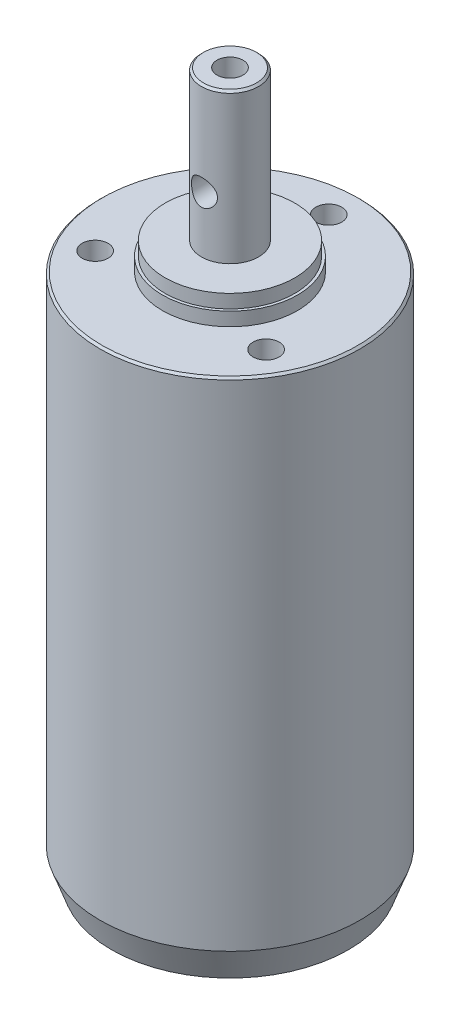
ISO-10303-21;
HEADER;
FILE_DESCRIPTION(('STEP AP214'),'2;1');
FILE_NAME('part.step','',(''),(''),'','','');
FILE_SCHEMA(('AUTOMOTIVE_DESIGN { 1 0 10303 214 1 1 1 1 }'));
ENDSEC;
DATA;
#1=APPLICATION_CONTEXT('core data for automotive mechanical design processes');
#2=APPLICATION_PROTOCOL_DEFINITION('international standard','automotive_design',2000,#1);
#3=PRODUCT_CONTEXT('',#1,'mechanical');
#4=PRODUCT('Part','Part','',(#3));
#5=PRODUCT_RELATED_PRODUCT_CATEGORY('part','',(#4));
#6=PRODUCT_DEFINITION_FORMATION('','',#4);
#7=PRODUCT_DEFINITION_CONTEXT('part definition',#1,'design');
#8=PRODUCT_DEFINITION('design','',#6,#7);
#9=PRODUCT_DEFINITION_SHAPE('','',#8);
#10=(LENGTH_UNIT() NAMED_UNIT(*) SI_UNIT(.MILLI.,.METRE.));
#11=(NAMED_UNIT(*) PLANE_ANGLE_UNIT() SI_UNIT($,.RADIAN.));
#12=(NAMED_UNIT(*) SI_UNIT($,.STERADIAN.) SOLID_ANGLE_UNIT());
#13=UNCERTAINTY_MEASURE_WITH_UNIT(LENGTH_MEASURE(1.E-05),#10,'distance_accuracy_value','');
#14=(GEOMETRIC_REPRESENTATION_CONTEXT(3) GLOBAL_UNCERTAINTY_ASSIGNED_CONTEXT((#13)) GLOBAL_UNIT_ASSIGNED_CONTEXT((#10,
#11,#12)) REPRESENTATION_CONTEXT('',''));
#15=CARTESIAN_POINT('',(0.,0.,0.));
#16=DIRECTION('',(0.,0.,1.));
#17=DIRECTION('',(1.,0.,0.));
#18=AXIS2_PLACEMENT_3D('',#15,#16,#17);
#19=CARTESIAN_POINT('',(0.,0.,0.));
#20=DIRECTION('',(0.,1.,0.));
#21=DIRECTION('',(0.,0.,1.));
#22=AXIS2_PLACEMENT_3D('',#19,#20,#21);
#23=PLANE('',#22);
#24=CARTESIAN_POINT('',(0.,0.,0.));
#25=DIRECTION('',(0.,1.,0.));
#26=DIRECTION('',(0.,0.,1.));
#27=AXIS2_PLACEMENT_3D('',#24,#25,#26);
#28=CIRCLE('',#27,2.55000000000002);
#29=CARTESIAN_POINT('',(0.,0.,2.55000000000002));
#30=VERTEX_POINT('',#29);
#31=EDGE_CURVE('E130',#30,#30,#28,.F.);
#32=ORIENTED_EDGE('',*,*,#31,.T.);
#33=EDGE_LOOP('',(#32));
#34=FACE_BOUND('',#33,.T.);
#35=ADVANCED_FACE('F38',(#34),#23,.F.);
#36=CARTESIAN_POINT('',(0.,90.0419303783524,0.));
#37=DIRECTION('',(0.,1.,0.));
#38=DIRECTION('',(0.,0.,1.));
#39=AXIS2_PLACEMENT_3D('',#36,#37,#38);
#40=CYLINDRICAL_SURFACE('',#39,2.75000000000001);
#41=CARTESIAN_POINT('',(0.,0.199999999999992,0.));
#42=DIRECTION('',(0.,1.,0.));
#43=DIRECTION('',(0.,0.,1.));
#44=AXIS2_PLACEMENT_3D('',#41,#42,#43);
#45=CIRCLE('',#44,2.75000000000001);
#46=CARTESIAN_POINT('',(0.,0.199999999999992,2.75000000000001));
#47=VERTEX_POINT('',#46);
#48=EDGE_CURVE('E127',#47,#47,#45,.T.);
#49=ORIENTED_EDGE('',*,*,#48,.T.);
#50=EDGE_LOOP('',(#49));
#51=FACE_BOUND('',#50,.T.);
#52=CARTESIAN_POINT('',(0.,4.,0.));
#53=DIRECTION('',(0.,1.,0.));
#54=DIRECTION('',(0.,0.,1.));
#55=AXIS2_PLACEMENT_3D('',#52,#53,#54);
#56=CIRCLE('',#55,2.75000000000001);
#57=CARTESIAN_POINT('',(0.,4.,2.75000000000001));
#58=VERTEX_POINT('',#57);
#59=EDGE_CURVE('E112',#58,#58,#56,.T.);
#60=ORIENTED_EDGE('',*,*,#59,.F.);
#61=EDGE_LOOP('',(#60));
#62=FACE_BOUND('',#61,.T.);
#63=ADVANCED_FACE('F175',(#51,#62),#40,.T.);
#64=CARTESIAN_POINT('',(0.,4.,-2.75000000000001));
#65=DIRECTION('',(0.,1.,0.));
#66=DIRECTION('',(0.,0.,1.));
#67=AXIS2_PLACEMENT_3D('',#64,#65,#66);
#68=PLANE('',#67);
#69=CARTESIAN_POINT('',(0.,4.,0.));
#70=DIRECTION('',(0.,1.,0.));
#71=DIRECTION('',(0.,0.,1.));
#72=AXIS2_PLACEMENT_3D('',#69,#70,#71);
#73=CIRCLE('',#72,11.4080892972014);
#74=CARTESIAN_POINT('',(0.,4.,11.4080892972014));
#75=VERTEX_POINT('',#74);
#76=EDGE_CURVE('E50',#75,#75,#73,.F.);
#77=ORIENTED_EDGE('',*,*,#76,.T.);
#78=EDGE_LOOP('',(#77));
#79=FACE_BOUND('',#78,.T.);
#80=ORIENTED_EDGE('',*,*,#59,.T.);
#81=EDGE_LOOP('',(#80));
#82=FACE_BOUND('',#81,.T.);
#83=ADVANCED_FACE('F181',(#79,#82),#68,.F.);
#84=CARTESIAN_POINT('',(0.,90.0419303783524,0.));
#85=DIRECTION('',(0.,1.,0.));
#86=DIRECTION('',(0.,0.,1.));
#87=AXIS2_PLACEMENT_3D('',#84,#85,#86);
#88=CYLINDRICAL_SURFACE('',#87,12.5);
#89=CARTESIAN_POINT('',(0.,7.00000000000001,0.));
#90=DIRECTION('',(0.,1.,0.));
#91=DIRECTION('',(0.,0.,1.));
#92=AXIS2_PLACEMENT_3D('',#89,#90,#91);
#93=CIRCLE('',#92,12.5);
#94=CARTESIAN_POINT('',(0.,7.00000000000001,12.5));
#95=VERTEX_POINT('',#94);
#96=EDGE_CURVE('E133',#95,#95,#93,.T.);
#97=ORIENTED_EDGE('',*,*,#96,.T.);
#98=EDGE_LOOP('',(#97));
#99=FACE_BOUND('',#98,.T.);
#100=CARTESIAN_POINT('',(0.,54.6,0.));
#101=DIRECTION('',(0.,-1.,0.));
#102=DIRECTION('',(0.,0.,-1.));
#103=AXIS2_PLACEMENT_3D('',#100,#101,#102);
#104=CIRCLE('',#103,12.5);
#105=CARTESIAN_POINT('',(0.,54.6,-12.5));
#106=VERTEX_POINT('',#105);
#107=EDGE_CURVE('E118',#106,#106,#104,.T.);
#108=ORIENTED_EDGE('',*,*,#107,.T.);
#109=EDGE_LOOP('',(#108));
#110=FACE_BOUND('',#109,.T.);
#111=ADVANCED_FACE('F202',(#99,#110),#88,.T.);
#112=CARTESIAN_POINT('',(0.,54.8,-12.5));
#113=DIRECTION('',(0.,-1.,0.));
#114=DIRECTION('',(0.,0.,-1.));
#115=AXIS2_PLACEMENT_3D('',#112,#113,#114);
#116=PLANE('',#115);
#117=CARTESIAN_POINT('',(0.,54.8,-9.5));
#118=DIRECTION('',(0.,1.,0.));
#119=DIRECTION('',(0.,0.,1.));
#120=AXIS2_PLACEMENT_3D('',#117,#118,#119);
#121=CIRCLE('',#120,1.24999999999999);
#122=CARTESIAN_POINT('',(0.,54.8,-8.25000000000001));
#123=VERTEX_POINT('',#122);
#124=EDGE_CURVE('E74',#123,#123,#121,.T.);
#125=ORIENTED_EDGE('',*,*,#124,.F.);
#126=EDGE_LOOP('',(#125));
#127=FACE_BOUND('',#126,.T.);
#128=CARTESIAN_POINT('',(-8.22724133595218,54.8,4.74999999999998));
#129=DIRECTION('',(0.,1.,0.));
#130=DIRECTION('',(0.,0.,1.));
#131=AXIS2_PLACEMENT_3D('',#128,#129,#130);
#132=CIRCLE('',#131,1.24999999999999);
#133=CARTESIAN_POINT('',(-8.22724133595218,54.8,5.99999999999997));
#134=VERTEX_POINT('',#133);
#135=EDGE_CURVE('E73',#134,#134,#132,.T.);
#136=ORIENTED_EDGE('',*,*,#135,.F.);
#137=EDGE_LOOP('',(#136));
#138=FACE_BOUND('',#137,.T.);
#139=CARTESIAN_POINT('',(8.22724133595218,54.8,4.74999999999998));
#140=DIRECTION('',(0.,1.,0.));
#141=DIRECTION('',(0.,0.,1.));
#142=AXIS2_PLACEMENT_3D('',#139,#140,#141);
#143=CIRCLE('',#142,1.24999999999999);
#144=CARTESIAN_POINT('',(8.22724133595218,54.8,5.99999999999997));
#145=VERTEX_POINT('',#144);
#146=EDGE_CURVE('E84',#145,#145,#143,.T.);
#147=ORIENTED_EDGE('',*,*,#146,.F.);
#148=EDGE_LOOP('',(#147));
#149=FACE_BOUND('',#148,.T.);
#150=CARTESIAN_POINT('',(0.,54.8,0.));
#151=DIRECTION('',(0.,-1.,0.));
#152=DIRECTION('',(0.,0.,-1.));
#153=AXIS2_PLACEMENT_3D('',#150,#151,#152);
#154=CIRCLE('',#153,12.3);
#155=CARTESIAN_POINT('',(0.,54.8,-12.3));
#156=VERTEX_POINT('',#155);
#157=EDGE_CURVE('E115',#156,#156,#154,.F.);
#158=ORIENTED_EDGE('',*,*,#157,.T.);
#159=EDGE_LOOP('',(#158));
#160=FACE_BOUND('',#159,.T.);
#161=CARTESIAN_POINT('',(0.,54.8,0.));
#162=DIRECTION('',(0.,1.,0.));
#163=DIRECTION('',(0.,0.,1.));
#164=AXIS2_PLACEMENT_3D('',#161,#162,#163);
#165=CIRCLE('',#164,6.5);
#166=CARTESIAN_POINT('',(0.,54.8,6.5));
#167=VERTEX_POINT('',#166);
#168=EDGE_CURVE('E109',#167,#167,#165,.T.);
#169=ORIENTED_EDGE('',*,*,#168,.F.);
#170=EDGE_LOOP('',(#169));
#171=FACE_BOUND('',#170,.T.);
#172=ADVANCED_FACE('F207',(#127,#138,#149,#160,#171),#116,.F.);
#173=CARTESIAN_POINT('',(0.,90.0419303783524,0.));
#174=DIRECTION('',(0.,1.,0.));
#175=DIRECTION('',(0.,0.,1.));
#176=AXIS2_PLACEMENT_3D('',#173,#174,#175);
#177=CYLINDRICAL_SURFACE('',#176,6.5);
#178=CARTESIAN_POINT('',(0.,56.1,0.));
#179=DIRECTION('',(0.,1.,0.));
#180=DIRECTION('',(0.,0.,1.));
#181=AXIS2_PLACEMENT_3D('',#178,#179,#180);
#182=CIRCLE('',#181,6.5);
#183=CARTESIAN_POINT('',(0.,56.1,6.5));
#184=VERTEX_POINT('',#183);
#185=EDGE_CURVE('E106',#184,#184,#182,.T.);
#186=ORIENTED_EDGE('',*,*,#185,.F.);
#187=EDGE_LOOP('',(#186));
#188=FACE_BOUND('',#187,.T.);
#189=ORIENTED_EDGE('',*,*,#168,.T.);
#190=EDGE_LOOP('',(#189));
#191=FACE_BOUND('',#190,.T.);
#192=ADVANCED_FACE('F213',(#188,#191),#177,.T.);
#193=CARTESIAN_POINT('',(0.,56.1,-6.23859170698182));
#194=DIRECTION('',(0.,-1.,0.));
#195=DIRECTION('',(0.,0.,-1.));
#196=AXIS2_PLACEMENT_3D('',#193,#194,#195);
#197=PLANE('',#196);
#198=CARTESIAN_POINT('',(0.,56.1,0.));
#199=DIRECTION('',(0.,1.,0.));
#200=DIRECTION('',(0.,0.,1.));
#201=AXIS2_PLACEMENT_3D('',#198,#199,#200);
#202=CIRCLE('',#201,6.23859170698182);
#203=CARTESIAN_POINT('',(0.,56.1,6.23859170698182));
#204=VERTEX_POINT('',#203);
#205=EDGE_CURVE('E103',#204,#204,#202,.T.);
#206=ORIENTED_EDGE('',*,*,#205,.F.);
#207=EDGE_LOOP('',(#206));
#208=FACE_BOUND('',#207,.T.);
#209=ORIENTED_EDGE('',*,*,#185,.T.);
#210=EDGE_LOOP('',(#209));
#211=FACE_BOUND('',#210,.T.);
#212=ADVANCED_FACE('F217',(#208,#211),#197,.F.);
#213=CARTESIAN_POINT('',(0.,90.0419303783524,0.));
#214=DIRECTION('',(0.,1.,0.));
#215=DIRECTION('',(0.,0.,1.));
#216=AXIS2_PLACEMENT_3D('',#213,#214,#215);
#217=CYLINDRICAL_SURFACE('',#216,6.23859170698182);
#218=CARTESIAN_POINT('',(0.,57.4,0.));
#219=DIRECTION('',(0.,1.,0.));
#220=DIRECTION('',(0.,0.,1.));
#221=AXIS2_PLACEMENT_3D('',#218,#219,#220);
#222=CIRCLE('',#221,6.23859170698182);
#223=CARTESIAN_POINT('',(0.,57.4,6.23859170698182));
#224=VERTEX_POINT('',#223);
#225=EDGE_CURVE('E100',#224,#224,#222,.T.);
#226=ORIENTED_EDGE('',*,*,#225,.F.);
#227=EDGE_LOOP('',(#226));
#228=FACE_BOUND('',#227,.T.);
#229=ORIENTED_EDGE('',*,*,#205,.T.);
#230=EDGE_LOOP('',(#229));
#231=FACE_BOUND('',#230,.T.);
#232=ADVANCED_FACE('F221',(#228,#231),#217,.T.);
#233=CARTESIAN_POINT('',(0.,57.4,-6.23859170698182));
#234=DIRECTION('',(0.,-1.,0.));
#235=DIRECTION('',(0.,0.,-1.));
#236=AXIS2_PLACEMENT_3D('',#233,#234,#235);
#237=PLANE('',#236);
#238=CARTESIAN_POINT('',(0.,57.4,0.));
#239=DIRECTION('',(0.,1.,0.));
#240=DIRECTION('',(0.,0.,1.));
#241=AXIS2_PLACEMENT_3D('',#238,#239,#240);
#242=CIRCLE('',#241,2.75);
#243=CARTESIAN_POINT('',(0.,57.4,2.75));
#244=VERTEX_POINT('',#243);
#245=EDGE_CURVE('E97',#244,#244,#242,.T.);
#246=ORIENTED_EDGE('',*,*,#245,.F.);
#247=EDGE_LOOP('',(#246));
#248=FACE_BOUND('',#247,.T.);
#249=ORIENTED_EDGE('',*,*,#225,.T.);
#250=EDGE_LOOP('',(#249));
#251=FACE_BOUND('',#250,.T.);
#252=ADVANCED_FACE('F170',(#248,#251),#237,.F.);
#253=CARTESIAN_POINT('',(0.,90.0419303783524,0.));
#254=DIRECTION('',(0.,1.,0.));
#255=DIRECTION('',(0.,0.,1.));
#256=AXIS2_PLACEMENT_3D('',#253,#254,#255);
#257=CYLINDRICAL_SURFACE('',#256,2.75);
#258=CARTESIAN_POINT('',(0.,61.55,2.75));
#259=CARTESIAN_POINT('',(-0.0664092972011224,61.5500033557613,2.74999722006382));
#260=CARTESIAN_POINT('',(-0.132918179160473,61.5553234108164,2.74756773000004));
#261=CARTESIAN_POINT('',(-0.264013618832329,61.5763886766761,2.73809041057662));
#262=CARTESIAN_POINT('',(-0.328595352707352,61.592158073493,2.73103186721672));
#263=CARTESIAN_POINT('',(-0.45373345753166,61.6334026879228,2.71304396647087));
#264=CARTESIAN_POINT('',(-0.514303514696174,61.6588426722482,2.70212867062397));
#265=CARTESIAN_POINT('',(-0.630245824955315,61.7185447192446,2.67746302459247));
#266=CARTESIAN_POINT('',(-0.685619117274927,61.7528050129194,2.66371324300075));
#267=CARTESIAN_POINT('',(-0.792876404622117,61.8312429596039,2.63383894536601));
#268=CARTESIAN_POINT('',(-0.844423861031629,61.875847338062,2.61762758087896));
#269=CARTESIAN_POINT('',(-0.93960583378293,61.9727994558039,2.58499080357135));
#270=CARTESIAN_POINT('',(-0.983235414967033,62.0251519878079,2.56856526404589));
#271=CARTESIAN_POINT('',(-1.0639942192231,62.1399724708472,2.53622246241454));
#272=CARTESIAN_POINT('',(-1.10056379760174,62.2028629034675,2.5203974898297));
#273=CARTESIAN_POINT('',(-1.16245662732703,62.3347160096519,2.492459833644));
#274=CARTESIAN_POINT('',(-1.1877867250721,62.4036749558868,2.4803448915189));
#275=CARTESIAN_POINT('',(-1.22502813882895,62.5418477428022,2.46215702137186));
#276=CARTESIAN_POINT('',(-1.23759151471748,62.6108457903637,2.4557925721087));
#277=CARTESIAN_POINT('',(-1.25096639629459,62.7502409727118,2.44900910731336));
#278=CARTESIAN_POINT('',(-1.25178632043296,62.8206370690328,2.4485858327753));
#279=CARTESIAN_POINT('',(-1.24213570599714,62.9537053601308,2.45349076513662));
#280=CARTESIAN_POINT('',(-1.23272508141616,63.0164786647792,2.45827909061314));
#281=CARTESIAN_POINT('',(-1.20468382543911,63.1394330382549,2.47214054978988));
#282=CARTESIAN_POINT('',(-1.18605099348516,63.1996134846596,2.48121470613038));
#283=CARTESIAN_POINT('',(-1.13972592389796,63.3173182899441,2.50283604109401));
#284=CARTESIAN_POINT('',(-1.11183710259722,63.3747509930054,2.51545758142744));
#285=CARTESIAN_POINT('',(-1.0479342963697,63.4843707276341,2.54274244453581));
#286=CARTESIAN_POINT('',(-1.01191682605957,63.5365554950875,2.55740664212108));
#287=CARTESIAN_POINT('',(-0.928462390288513,63.639823282612,2.58894610793607));
#288=CARTESIAN_POINT('',(-0.880233766499671,63.6902463667673,2.60589402991581));
#289=CARTESIAN_POINT('',(-0.77587407624586,63.7825341366434,2.63884684198751));
#290=CARTESIAN_POINT('',(-0.719740410517147,63.8243959961933,2.65485141943222));
#291=CARTESIAN_POINT('',(-0.598831409627824,63.8996033419798,2.68475267309384));
#292=CARTESIAN_POINT('',(-0.533836033425859,63.9326312395119,2.69856489262048));
#293=CARTESIAN_POINT('',(-0.398422448040726,63.9870441979395,2.72184968026242));
#294=CARTESIAN_POINT('',(-0.328007850689101,64.0084369380899,2.73132511002179));
#295=CARTESIAN_POINT('',(-0.189224957177742,64.0374776846817,2.74430245200302));
#296=CARTESIAN_POINT('',(-0.121077242101441,64.0460081996043,2.74818697383876));
#297=CARTESIAN_POINT('',(0.0157830218141263,64.0517734422305,2.75080503667139));
#298=CARTESIAN_POINT('',(0.0844953578581027,64.0490122467711,2.74954043674346));
#299=CARTESIAN_POINT('',(0.216073389246549,64.0328570954785,2.74224203969369));
#300=CARTESIAN_POINT('',(0.279039063698163,64.0201262392303,2.73650576628531));
#301=CARTESIAN_POINT('',(0.401846731740723,63.9853663369372,2.72118555280464));
#302=CARTESIAN_POINT('',(0.461688350977593,63.9633361794221,2.71160115280357));
#303=CARTESIAN_POINT('',(0.578663737582029,63.909915125959,2.68910907975177));
#304=CARTESIAN_POINT('',(0.635655904758832,63.8782550325619,2.67610753251244));
#305=CARTESIAN_POINT('',(0.743723074643524,63.8067662226669,2.64811200049283));
#306=CARTESIAN_POINT('',(0.794795467118607,63.7669339240432,2.63311714300231));
#307=CARTESIAN_POINT('',(0.894095643067367,63.6763446734378,2.60116069331973));
#308=CARTESIAN_POINT('',(0.941725318261066,63.6249515546263,2.58413964097088));
#309=CARTESIAN_POINT('',(1.02789777986371,63.5147188168789,2.55109013589481));
#310=CARTESIAN_POINT('',(1.06643685729908,63.4558761735236,2.53506209027516));
#311=CARTESIAN_POINT('',(1.13425708875271,63.3302729155873,2.5054683792703));
#312=CARTESIAN_POINT('',(1.16325589057754,63.2633396279147,2.49198214330476));
#313=CARTESIAN_POINT('',(1.20928572229315,63.1247252932722,2.46997777901049));
#314=CARTESIAN_POINT('',(1.22632915900213,63.0530492529609,2.46145450187976));
#315=CARTESIAN_POINT('',(1.2466290380409,62.9137186902161,2.45123100377803));
#316=CARTESIAN_POINT('',(1.25095942837577,62.84625953889,2.44899997173237));
#317=CARTESIAN_POINT('',(1.24868510401171,62.7115834540738,2.45016089632338));
#318=CARTESIAN_POINT('',(1.24208302836413,62.6443664660517,2.45355149592204));
#319=CARTESIAN_POINT('',(1.21908425290036,62.5166868525956,2.4650517093085));
#320=CARTESIAN_POINT('',(1.20335999852458,62.4560706930244,2.47283643484034));
#321=CARTESIAN_POINT('',(1.1632932854238,62.3383535904615,2.49193468099744));
#322=CARTESIAN_POINT('',(1.13894830444562,62.2812536820007,2.5032492342647));
#323=CARTESIAN_POINT('',(1.08052106704644,62.1681064900194,2.52904242136797));
#324=CARTESIAN_POINT('',(1.04590750399576,62.1123704781006,2.54367923604935));
#325=CARTESIAN_POINT('',(0.968596555260972,62.0071656086921,2.57411065746893));
#326=CARTESIAN_POINT('',(0.925895603760455,61.9576995318042,2.58990577302477));
#327=CARTESIAN_POINT('',(0.828924012690169,61.8616700492789,2.62263949427761));
#328=CARTESIAN_POINT('',(0.773945978687965,61.8158068811293,2.6395474679947));
#329=CARTESIAN_POINT('',(0.656497888375388,61.7338686712023,2.6711803863168));
#330=CARTESIAN_POINT('',(0.594024380555966,61.6977981638776,2.68590431818336));
#331=CARTESIAN_POINT('',(0.463719738066234,61.6369915228084,2.71142629318597));
#332=CARTESIAN_POINT('',(0.39594063215344,61.6121583674839,2.72225776873055));
#333=CARTESIAN_POINT('',(0.256651849448484,61.5745196063775,2.73888892791797));
#334=CARTESIAN_POINT('',(0.185154127024107,61.561677703486,2.74470379257751));
#335=CARTESIAN_POINT('',(0.0943030237739438,61.5534182992831,2.74844792420964));
#336=CARTESIAN_POINT('',(0.0754723356989334,61.5521377168886,2.74902888293267));
#337=CARTESIAN_POINT('',(0.0377637835624746,61.5504280835196,2.74980531908613));
#338=CARTESIAN_POINT('',(0.0188859187785936,61.5499990456662,2.75000079057679));
#339=CARTESIAN_POINT('',(0.,61.55,2.75));
#340=B_SPLINE_CURVE_WITH_KNOTS('',3,(#258,#259,#260,#261,#262,#263,#264,#265,#266,#267,#268,
#269,#270,#271,#272,#273,#274,#275,#276,#277,#278,#279,#280,#281,#282,#283,#284,#285,#286,#287,
#288,#289,#290,#291,#292,#293,#294,#295,#296,#297,#298,#299,#300,#301,#302,#303,#304,#305,#306,
#307,#308,#309,#310,#311,#312,#313,#314,#315,#316,#317,#318,#319,#320,#321,#322,#323,#324,#325,
#326,#327,#328,#329,#330,#331,#332,#333,#334,#335,#336,#337,#338,#339),.UNSPECIFIED.,.T.,.F.,(4,
2,2,2,2,2,2,2,2,2,2,2,2,2,2,2,2,2,2,2,2,2,2,2,2,2,2,2,2,2,2,2,2,2,2,2,2,2,2,2,4),(0.,
0.199150465500599,0.398763501700329,0.597656142874555,0.796508925288676,1.00581702909931,
1.21525514848388,1.43748275689134,1.65957481148717,1.86964669042412,2.07956796899307,
2.26964626889944,2.45976994623912,2.65422185099477,2.84875729133089,3.06321184122664,
3.27773707147315,3.499169199695,3.72045500384426,3.92572957947017,4.13093004789079,
4.32353422798303,4.51616143501639,4.71476455610416,4.91345491768043,5.12881429156232,
5.34426138090044,5.56560701120831,5.78672259633827,5.98852995638712,6.1902886080886,
6.37878337463004,6.56733333662169,6.76817468068631,6.96910478488004,7.18876214345759,
7.40852104069103,7.62634457271378,7.84350660241819,7.90014146715372,7.95677720453809),.UNSPECIFIED.);
#341=CARTESIAN_POINT('',(0.,61.55,2.75));
#342=VERTEX_POINT('',#341);
#343=EDGE_CURVE('E11',#342,#342,#340,.T.);
#344=ORIENTED_EDGE('',*,*,#343,.T.);
#345=EDGE_LOOP('',(#344));
#346=FACE_BOUND('',#345,.T.);
#347=CARTESIAN_POINT('',(1.24999999999999,62.8,-2.44948974278318));
#348=CARTESIAN_POINT('',(1.249996493504,62.8660084287767,-2.44949368228765));
#349=CARTESIAN_POINT('',(1.24473782444838,62.9321198220134,-2.45219701957715));
#350=CARTESIAN_POINT('',(1.22393957837268,63.0623823509639,-2.46264090706275));
#351=CARTESIAN_POINT('',(1.20837468013771,63.1265282505432,-2.47039386281899));
#352=CARTESIAN_POINT('',(1.16772642001967,63.2507385342628,-2.4898625437228));
#353=CARTESIAN_POINT('',(1.14268689094072,63.3108202342705,-2.50155999360656));
#354=CARTESIAN_POINT('',(1.08393224916962,63.4259150929374,-2.52757186133797));
#355=CARTESIAN_POINT('',(1.05021805532978,63.4809287875807,-2.54188600196968));
#356=CARTESIAN_POINT('',(0.972392408700552,63.5884471366321,-2.57270625364898));
#357=CARTESIAN_POINT('',(0.927732432282856,63.6405312322487,-2.58929511801969));
#358=CARTESIAN_POINT('',(0.83043006696105,63.7367882742074,-2.62212163999064));
#359=CARTESIAN_POINT('',(0.777784257759743,63.7809578130134,-2.6383591436833));
#360=CARTESIAN_POINT('',(0.662562027156213,63.8624255664303,-2.6696924386621));
#361=CARTESIAN_POINT('',(0.599605600022139,63.8992313472453,-2.68468107121254));
#362=CARTESIAN_POINT('',(0.467587746509005,63.9615424957166,-2.71078910043922));
#363=CARTESIAN_POINT('',(0.398529543785699,63.9870537880965,-2.72191052506913));
#364=CARTESIAN_POINT('',(0.260702263713022,64.0244671670534,-2.73844039615752));
#365=CARTESIAN_POINT('',(0.192168860207232,64.0370997486642,-2.74415398467794));
#366=CARTESIAN_POINT('',(0.0537337492110702,64.050777240312,-2.75034616684861));
#367=CARTESIAN_POINT('',(-0.0161672725634622,64.0518278155336,-2.75082731987365));
#368=CARTESIAN_POINT('',(-0.149965080853623,64.0426509865534,-2.74666518415707));
#369=CARTESIAN_POINT('',(-0.213931079826316,64.0332321323526,-2.74238926124843));
#370=CARTESIAN_POINT('',(-0.339258309266339,64.0047960668256,-2.72972015837754));
#371=CARTESIAN_POINT('',(-0.400619346222466,63.9857781437745,-2.72132667311912));
#372=CARTESIAN_POINT('',(-0.520129625913244,63.9384899841052,-2.70105493201454));
#373=CARTESIAN_POINT('',(-0.578216222535322,63.9100841047975,-2.68912586975713));
#374=CARTESIAN_POINT('',(-0.68894998656135,63.8449773331468,-2.66291017293157));
#375=CARTESIAN_POINT('',(-0.741595151340298,63.8082734025775,-2.64862267537057));
#376=CARTESIAN_POINT('',(-0.844521462681014,63.7241502443558,-2.61770923899541));
#377=CARTESIAN_POINT('',(-0.894259880394288,63.6761013528628,-2.60098761803526));
#378=CARTESIAN_POINT('',(-0.985234665281763,63.5723828769874,-2.56790977516793));
#379=CARTESIAN_POINT('',(-1.02646641790382,63.5167091835322,-2.55155375585301));
#380=CARTESIAN_POINT('',(-1.10104506894183,63.3961900503594,-2.52029978809173));
#381=CARTESIAN_POINT('',(-1.13395121798233,63.3310437500106,-2.50550118974753));
#382=CARTESIAN_POINT('',(-1.1880966741559,63.1952896698464,-2.48028797326795));
#383=CARTESIAN_POINT('',(-1.20934612514664,63.1246866997649,-2.46986954528398));
#384=CARTESIAN_POINT('',(-1.23805393738081,62.985471789565,-2.45559834607939));
#385=CARTESIAN_POINT('',(-1.24640186410718,62.9170876891051,-2.45132366398273));
#386=CARTESIAN_POINT('',(-1.25172089001371,62.7797767027894,-2.44861334601463));
#387=CARTESIAN_POINT('',(-1.24869736351006,62.7108500887004,-2.45017495182541));
#388=CARTESIAN_POINT('',(-1.2321742269346,62.5804317330459,-2.45851920297554));
#389=CARTESIAN_POINT('',(-1.21955926621106,62.5187956722197,-2.4648605869208));
#390=CARTESIAN_POINT('',(-1.18544405201489,62.3985924025737,-2.48144703005369));
#391=CARTESIAN_POINT('',(-1.16394143575354,62.3400260144972,-2.49169312725522));
#392=CARTESIAN_POINT('',(-1.11159822979466,62.2246347638006,-2.51549375704147));
#393=CARTESIAN_POINT('',(-1.08037807246865,62.1680096275789,-2.52917735570446));
#394=CARTESIAN_POINT('',(-1.00984087724323,62.0605003994497,-2.55815836558199));
#395=CARTESIAN_POINT('',(-0.970519936824036,62.0096190929651,-2.57345655287929));
#396=CARTESIAN_POINT('',(-0.880267857698425,61.9097186940626,-2.60579094908278));
#397=CARTESIAN_POINT('',(-0.828567938261515,61.8613977663254,-2.62284763397897));
#398=CARTESIAN_POINT('',(-0.717441468187265,61.773950886725,-2.6553959105149));
#399=CARTESIAN_POINT('',(-0.658013600012902,61.7348265059805,-2.67088723447429));
#400=CARTESIAN_POINT('',(-0.532064634336904,61.6666025166755,-2.69881612600613));
#401=CARTESIAN_POINT('',(-0.465471699055589,61.6376198063231,-2.71121763780737));
#402=CARTESIAN_POINT('',(-0.327635980482046,61.5915195436663,-2.73129834562413));
#403=CARTESIAN_POINT('',(-0.256396588146284,61.5743934421867,-2.73898094374761));
#404=CARTESIAN_POINT('',(-0.117466176582588,61.5537124099364,-2.74830068808535));
#405=CARTESIAN_POINT('',(-0.0499494636179367,61.5491783057658,-2.75037367442807));
#406=CARTESIAN_POINT('',(0.0848898576600107,61.5510658720958,-2.74951533998594));
#407=CARTESIAN_POINT('',(0.152212508787338,61.557484905484,-2.74658522376394));
#408=CARTESIAN_POINT('',(0.281391999197496,61.5804027772738,-2.73629690997646));
#409=CARTESIAN_POINT('',(0.343356169931416,61.5964039003403,-2.72915761294651));
#410=CARTESIAN_POINT('',(0.463664188063034,61.6374350437375,-2.71131278427637));
#411=CARTESIAN_POINT('',(0.522007419358066,61.6624665956857,-2.70060664770133));
#412=CARTESIAN_POINT('',(0.636378008545815,61.7220985414297,-2.6760233581899));
#413=CARTESIAN_POINT('',(0.692177439915822,61.7570841833043,-2.66202358016365));
#414=CARTESIAN_POINT('',(0.797359045105208,61.8351107805427,-2.63243399966462));
#415=CARTESIAN_POINT('',(0.846738398309345,61.8781552563692,-2.61684350365392));
#416=CARTESIAN_POINT('',(0.941951228398706,61.9752427647308,-2.5841761482303));
#417=CARTESIAN_POINT('',(0.987154004244786,62.0299008972429,-2.56708296999995));
#418=CARTESIAN_POINT('',(1.06790018403238,62.1464585996573,-2.53455914709153));
#419=CARTESIAN_POINT('',(1.10343722102545,62.2083629044978,-2.5191296022894));
#420=CARTESIAN_POINT('',(1.16392442382467,62.338512457508,-2.49176565985744));
#421=CARTESIAN_POINT('',(1.18878813351711,62.4068042250238,-2.47986003874526));
#422=CARTESIAN_POINT('',(1.22631765086683,62.5472358341911,-2.46152275925822));
#423=CARTESIAN_POINT('',(1.23902440311467,62.6193618892545,-2.45507273502284));
#424=CARTESIAN_POINT('',(1.24688636059436,62.7099910980973,-2.45107611117237));
#425=CARTESIAN_POINT('',(1.24805272823733,62.7279654437734,-2.45048261290849));
#426=CARTESIAN_POINT('',(1.24961004053749,62.7639572992878,-2.44968888381116));
#427=CARTESIAN_POINT('',(1.25000095753308,62.7819748106429,-2.44948866700672));
#428=CARTESIAN_POINT('',(1.24999999999999,62.8,-2.44948974278318));
#429=B_SPLINE_CURVE_WITH_KNOTS('',3,(#347,#348,#349,#350,#351,#352,#353,#354,#355,#356,#357,
#358,#359,#360,#361,#362,#363,#364,#365,#366,#367,#368,#369,#370,#371,#372,#373,#374,#375,#376,
#377,#378,#379,#380,#381,#382,#383,#384,#385,#386,#387,#388,#389,#390,#391,#392,#393,#394,#395,
#396,#397,#398,#399,#400,#401,#402,#403,#404,#405,#406,#407,#408,#409,#410,#411,#412,#413,#414,
#415,#416,#417,#418,#419,#420,#421,#422,#423,#424,#425,#426,#427,#428),.UNSPECIFIED.,.T.,.F.,(4,
2,2,2,2,2,2,2,2,2,2,2,2,2,2,2,2,2,2,2,2,2,2,2,2,2,2,2,2,2,2,2,2,2,2,2,2,2,2,2,4),(0.,
0.197949490145129,0.396387132894559,0.593917744022093,0.791427440589967,1.00227982105297,
1.21322276498815,1.4354219242707,1.65750438655094,1.86613997239168,2.07467350237462,
2.26815547775455,2.46165180100118,2.65807591784025,2.85457206969011,3.06708946120133,
3.27972183419201,3.50196731162575,3.72401907920017,3.92994297853521,4.13576956743681,
4.32461933407747,4.51351933887029,4.71099397075553,4.90856395864762,5.12594226056976,
5.34335767200031,5.56320241144757,5.78288846688925,5.98493699995729,6.18693689403804,
6.37925788088368,6.57161150192541,6.77276176443703,6.97400010437288,7.19187634216834,
7.40989575221208,7.62964928571051,7.84866005711306,7.90271299908975,7.95676786918955),.UNSPECIFIED.);
#430=CARTESIAN_POINT('',(1.24999999999999,62.8,-2.44948974278318));
#431=VERTEX_POINT('',#430);
#432=EDGE_CURVE('E90',#431,#431,#429,.T.);
#433=ORIENTED_EDGE('',*,*,#432,.T.);
#434=EDGE_LOOP('',(#433));
#435=FACE_BOUND('',#434,.T.);
#436=CARTESIAN_POINT('',(0.,71.6,0.));
#437=DIRECTION('',(0.,-1.,0.));
#438=DIRECTION('',(0.,0.,-1.));
#439=AXIS2_PLACEMENT_3D('',#436,#437,#438);
#440=CIRCLE('',#439,2.75);
#441=CARTESIAN_POINT('',(0.,71.6,-2.75));
#442=VERTEX_POINT('',#441);
#443=EDGE_CURVE('E124',#442,#442,#440,.T.);
#444=ORIENTED_EDGE('',*,*,#443,.T.);
#445=EDGE_LOOP('',(#444));
#446=FACE_BOUND('',#445,.T.);
#447=ORIENTED_EDGE('',*,*,#245,.T.);
#448=EDGE_LOOP('',(#447));
#449=FACE_BOUND('',#448,.T.);
#450=ADVANCED_FACE('F140',(#346,#435,#446,#449),#257,.T.);
#451=CARTESIAN_POINT('',(0.,71.8,-2.75));
#452=DIRECTION('',(0.,-1.,0.));
#453=DIRECTION('',(0.,0.,-1.));
#454=AXIS2_PLACEMENT_3D('',#451,#452,#453);
#455=PLANE('',#454);
#456=CARTESIAN_POINT('',(0.,71.8,0.));
#457=DIRECTION('',(0.,1.,0.));
#458=DIRECTION('',(0.,0.,1.));
#459=AXIS2_PLACEMENT_3D('',#456,#457,#458);
#460=CIRCLE('',#459,1.24999999999999);
#461=CARTESIAN_POINT('',(0.,71.8,1.24999999999999));
#462=VERTEX_POINT('',#461);
#463=EDGE_CURVE('E91',#462,#462,#460,.T.);
#464=ORIENTED_EDGE('',*,*,#463,.F.);
#465=EDGE_LOOP('',(#464));
#466=FACE_BOUND('',#465,.T.);
#467=CARTESIAN_POINT('',(0.,71.8,0.));
#468=DIRECTION('',(0.,-1.,0.));
#469=DIRECTION('',(0.,0.,-1.));
#470=AXIS2_PLACEMENT_3D('',#467,#468,#469);
#471=CIRCLE('',#470,2.55000000000002);
#472=CARTESIAN_POINT('',(0.,71.8,-2.55000000000002));
#473=VERTEX_POINT('',#472);
#474=EDGE_CURVE('E121',#473,#473,#471,.F.);
#475=ORIENTED_EDGE('',*,*,#474,.T.);
#476=EDGE_LOOP('',(#475));
#477=FACE_BOUND('',#476,.T.);
#478=ADVANCED_FACE('F159',(#466,#477),#455,.F.);
#479=CARTESIAN_POINT('',(0.,54.8,0.));
#480=DIRECTION('',(0.,-1.,0.));
#481=DIRECTION('',(0.,0.,-1.));
#482=AXIS2_PLACEMENT_3D('',#479,#480,#481);
#483=CONICAL_SURFACE('',#482,12.3,0.785398163397474);
#484=ORIENTED_EDGE('',*,*,#107,.F.);
#485=EDGE_LOOP('',(#484));
#486=FACE_BOUND('',#485,.T.);
#487=ORIENTED_EDGE('',*,*,#157,.F.);
#488=EDGE_LOOP('',(#487));
#489=FACE_BOUND('',#488,.T.);
#490=ADVANCED_FACE('F161',(#486,#489),#483,.T.);
#491=CARTESIAN_POINT('',(0.,71.8,0.));
#492=DIRECTION('',(0.,-1.,0.));
#493=DIRECTION('',(0.,0.,-1.));
#494=AXIS2_PLACEMENT_3D('',#491,#492,#493);
#495=CONICAL_SURFACE('',#494,2.55000000000002,0.78539816339743);
#496=ORIENTED_EDGE('',*,*,#443,.F.);
#497=EDGE_LOOP('',(#496));
#498=FACE_BOUND('',#497,.T.);
#499=ORIENTED_EDGE('',*,*,#474,.F.);
#500=EDGE_LOOP('',(#499));
#501=FACE_BOUND('',#500,.T.);
#502=ADVANCED_FACE('F167',(#498,#501),#495,.T.);
#503=CARTESIAN_POINT('',(0.,0.199999999999992,0.));
#504=DIRECTION('',(0.,1.,0.));
#505=DIRECTION('',(0.,0.,1.));
#506=AXIS2_PLACEMENT_3D('',#503,#504,#505);
#507=CONICAL_SURFACE('',#506,2.75000000000001,0.785398163397428);
#508=ORIENTED_EDGE('',*,*,#31,.F.);
#509=EDGE_LOOP('',(#508));
#510=FACE_BOUND('',#509,.T.);
#511=ORIENTED_EDGE('',*,*,#48,.F.);
#512=EDGE_LOOP('',(#511));
#513=FACE_BOUND('',#512,.T.);
#514=ADVANCED_FACE('F187',(#510,#513),#507,.T.);
#515=CARTESIAN_POINT('',(0.,7.00000000000001,0.));
#516=DIRECTION('',(0.,1.,0.));
#517=DIRECTION('',(0.,0.,1.));
#518=AXIS2_PLACEMENT_3D('',#515,#516,#517);
#519=CONICAL_SURFACE('',#518,12.5,0.349065850398864);
#520=ORIENTED_EDGE('',*,*,#76,.F.);
#521=EDGE_LOOP('',(#520));
#522=FACE_BOUND('',#521,.T.);
#523=ORIENTED_EDGE('',*,*,#96,.F.);
#524=EDGE_LOOP('',(#523));
#525=FACE_BOUND('',#524,.T.);
#526=ADVANCED_FACE('F40',(#522,#525),#519,.T.);
#527=CARTESIAN_POINT('',(0.,66.3,0.));
#528=DIRECTION('',(0.,1.,0.));
#529=DIRECTION('',(0.,0.,1.));
#530=AXIS2_PLACEMENT_3D('',#527,#528,#529);
#531=CONICAL_SURFACE('',#530,1.25,1.02974425867666);
#532=CARTESIAN_POINT('',(0.,65.5489242262156,0.));
#533=VERTEX_POINT('',#532);
#534=VERTEX_LOOP('',#533);
#535=FACE_BOUND('',#534,.T.);
#536=CARTESIAN_POINT('',(0.,66.3,0.));
#537=DIRECTION('',(0.,1.,0.));
#538=DIRECTION('',(0.,0.,1.));
#539=AXIS2_PLACEMENT_3D('',#536,#537,#538);
#540=CIRCLE('',#539,1.25);
#541=CARTESIAN_POINT('',(0.,66.3,1.25));
#542=VERTEX_POINT('',#541);
#543=EDGE_CURVE('E94',#542,#542,#540,.T.);
#544=ORIENTED_EDGE('',*,*,#543,.T.);
#545=EDGE_LOOP('',(#544));
#546=FACE_BOUND('',#545,.T.);
#547=ADVANCED_FACE('F156',(#535,#546),#531,.F.);
#548=CARTESIAN_POINT('',(0.,71.8,0.));
#549=DIRECTION('',(0.,1.,0.));
#550=DIRECTION('',(0.,0.,1.));
#551=AXIS2_PLACEMENT_3D('',#548,#549,#550);
#552=CYLINDRICAL_SURFACE('',#551,1.24999999999999);
#553=ORIENTED_EDGE('',*,*,#543,.F.);
#554=EDGE_LOOP('',(#553));
#555=FACE_BOUND('',#554,.T.);
#556=ORIENTED_EDGE('',*,*,#463,.T.);
#557=EDGE_LOOP('',(#556));
#558=FACE_BOUND('',#557,.T.);
#559=ADVANCED_FACE('F150',(#555,#558),#552,.F.);
#560=CARTESIAN_POINT('',(0.,62.8,2.75));
#561=DIRECTION('',(0.,0.,1.));
#562=DIRECTION('',(1.,0.,0.));
#563=AXIS2_PLACEMENT_3D('',#560,#561,#562);
#564=CYLINDRICAL_SURFACE('',#563,1.24999999999999);
#565=ORIENTED_EDGE('',*,*,#432,.F.);
#566=EDGE_LOOP('',(#565));
#567=FACE_BOUND('',#566,.T.);
#568=ORIENTED_EDGE('',*,*,#343,.F.);
#569=EDGE_LOOP('',(#568));
#570=FACE_BOUND('',#569,.T.);
#571=ADVANCED_FACE('F144',(#567,#570),#564,.F.);
#572=CARTESIAN_POINT('',(8.22724133595218,50.8,4.74999999999998));
#573=DIRECTION('',(0.,1.,0.));
#574=DIRECTION('',(0.,0.,1.));
#575=AXIS2_PLACEMENT_3D('',#572,#573,#574);
#576=CONICAL_SURFACE('',#575,1.25,1.02974425867666);
#577=CARTESIAN_POINT('',(8.22724133595218,50.0489242262156,4.74999999999998));
#578=VERTEX_POINT('',#577);
#579=VERTEX_LOOP('',#578);
#580=FACE_BOUND('',#579,.T.);
#581=CARTESIAN_POINT('',(8.22724133595218,50.8,4.74999999999998));
#582=DIRECTION('',(0.,1.,0.));
#583=DIRECTION('',(0.,0.,1.));
#584=AXIS2_PLACEMENT_3D('',#581,#582,#583);
#585=CIRCLE('',#584,1.25);
#586=CARTESIAN_POINT('',(8.22724133595218,50.8,5.99999999999998));
#587=VERTEX_POINT('',#586);
#588=EDGE_CURVE('E87',#587,#587,#585,.T.);
#589=ORIENTED_EDGE('',*,*,#588,.T.);
#590=EDGE_LOOP('',(#589));
#591=FACE_BOUND('',#590,.T.);
#592=ADVANCED_FACE('F149',(#580,#591),#576,.F.);
#593=CARTESIAN_POINT('',(8.22724133595218,54.8,4.74999999999998));
#594=DIRECTION('',(0.,1.,0.));
#595=DIRECTION('',(0.,0.,1.));
#596=AXIS2_PLACEMENT_3D('',#593,#594,#595);
#597=CYLINDRICAL_SURFACE('',#596,1.24999999999999);
#598=ORIENTED_EDGE('',*,*,#588,.F.);
#599=EDGE_LOOP('',(#598));
#600=FACE_BOUND('',#599,.T.);
#601=ORIENTED_EDGE('',*,*,#146,.T.);
#602=EDGE_LOOP('',(#601));
#603=FACE_BOUND('',#602,.T.);
#604=ADVANCED_FACE('F281',(#600,#603),#597,.F.);
#605=CARTESIAN_POINT('',(-8.22724133595218,50.8,4.74999999999998));
#606=DIRECTION('',(0.,1.,0.));
#607=DIRECTION('',(0.,0.,1.));
#608=AXIS2_PLACEMENT_3D('',#605,#606,#607);
#609=CONICAL_SURFACE('',#608,1.25,1.02974425867666);
#610=CARTESIAN_POINT('',(-8.22724133595218,50.0489242262156,4.74999999999998));
#611=VERTEX_POINT('',#610);
#612=VERTEX_LOOP('',#611);
#613=FACE_BOUND('',#612,.T.);
#614=CARTESIAN_POINT('',(-8.22724133595218,50.8,4.74999999999998));
#615=DIRECTION('',(0.,1.,0.));
#616=DIRECTION('',(0.,0.,1.));
#617=AXIS2_PLACEMENT_3D('',#614,#615,#616);
#618=CIRCLE('',#617,1.25);
#619=CARTESIAN_POINT('',(-8.22724133595218,50.8,5.99999999999998));
#620=VERTEX_POINT('',#619);
#621=EDGE_CURVE('E77',#620,#620,#618,.T.);
#622=ORIENTED_EDGE('',*,*,#621,.T.);
#623=EDGE_LOOP('',(#622));
#624=FACE_BOUND('',#623,.T.);
#625=ADVANCED_FACE('F289',(#613,#624),#609,.F.);
#626=CARTESIAN_POINT('',(-8.22724133595218,54.8,4.74999999999998));
#627=DIRECTION('',(0.,1.,0.));
#628=DIRECTION('',(0.,0.,1.));
#629=AXIS2_PLACEMENT_3D('',#626,#627,#628);
#630=CYLINDRICAL_SURFACE('',#629,1.24999999999999);
#631=ORIENTED_EDGE('',*,*,#621,.F.);
#632=EDGE_LOOP('',(#631));
#633=FACE_BOUND('',#632,.T.);
#634=ORIENTED_EDGE('',*,*,#135,.T.);
#635=EDGE_LOOP('',(#634));
#636=FACE_BOUND('',#635,.T.);
#637=ADVANCED_FACE('F67',(#633,#636),#630,.F.);
#638=CARTESIAN_POINT('',(0.,50.8,-9.5));
#639=DIRECTION('',(0.,1.,0.));
#640=DIRECTION('',(0.,0.,1.));
#641=AXIS2_PLACEMENT_3D('',#638,#639,#640);
#642=CONICAL_SURFACE('',#641,1.25,1.02974425867666);
#643=CARTESIAN_POINT('',(0.,50.0489242262156,-9.5));
#644=VERTEX_POINT('',#643);
#645=VERTEX_LOOP('',#644);
#646=FACE_BOUND('',#645,.T.);
#647=CARTESIAN_POINT('',(0.,50.8,-9.5));
#648=DIRECTION('',(0.,1.,0.));
#649=DIRECTION('',(0.,0.,1.));
#650=AXIS2_PLACEMENT_3D('',#647,#648,#649);
#651=CIRCLE('',#650,1.25);
#652=CARTESIAN_POINT('',(0.,50.8,-8.25));
#653=VERTEX_POINT('',#652);
#654=EDGE_CURVE('E71',#653,#653,#651,.T.);
#655=ORIENTED_EDGE('',*,*,#654,.T.);
#656=EDGE_LOOP('',(#655));
#657=FACE_BOUND('',#656,.T.);
#658=ADVANCED_FACE('F63',(#646,#657),#642,.F.);
#659=CARTESIAN_POINT('',(0.,54.8,-9.5));
#660=DIRECTION('',(0.,1.,0.));
#661=DIRECTION('',(0.,0.,1.));
#662=AXIS2_PLACEMENT_3D('',#659,#660,#661);
#663=CYLINDRICAL_SURFACE('',#662,1.24999999999999);
#664=ORIENTED_EDGE('',*,*,#654,.F.);
#665=EDGE_LOOP('',(#664));
#666=FACE_BOUND('',#665,.T.);
#667=ORIENTED_EDGE('',*,*,#124,.T.);
#668=EDGE_LOOP('',(#667));
#669=FACE_BOUND('',#668,.T.);
#670=ADVANCED_FACE('F66',(#666,#669),#663,.F.);
#671=CLOSED_SHELL('',(#35,#63,#83,#111,#172,#192,#212,#232,#252,#450,#478,#490,#502,#514,#526,
#547,#559,#571,#592,#604,#625,#637,#658,#670));
#672=MANIFOLD_SOLID_BREP('B2',#671);
#673=ADVANCED_BREP_SHAPE_REPRESENTATION('',(#18,#672),#14);
#674=SHAPE_DEFINITION_REPRESENTATION(#9,#673);
ENDSEC;
END-ISO-10303-21;
